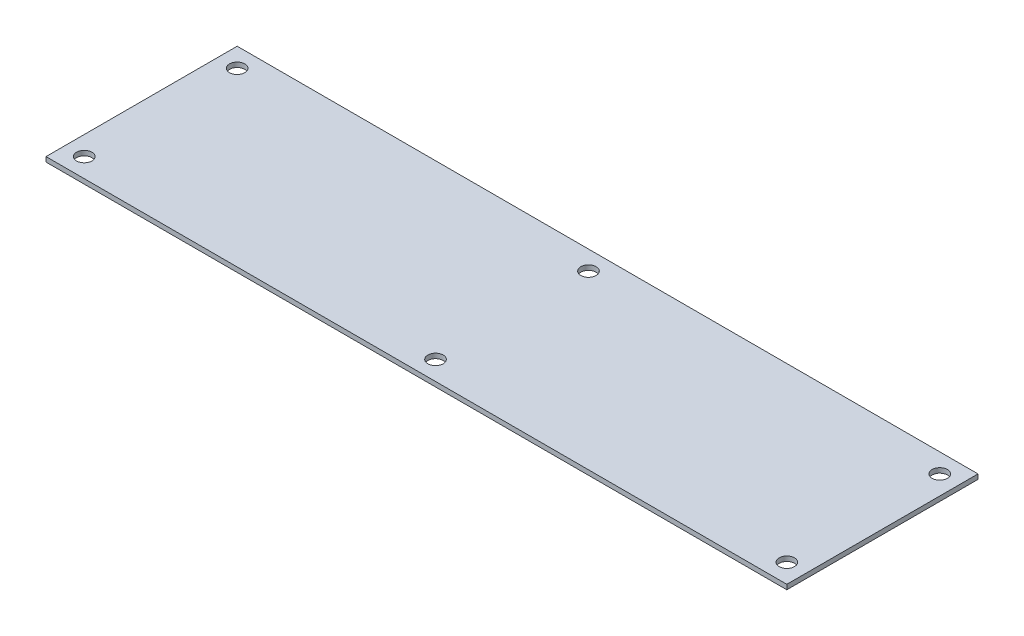
ISO-10303-21;
HEADER;
FILE_DESCRIPTION(('STEP AP214'),'2;1');
FILE_NAME('part.step','',(''),(''),'','','');
FILE_SCHEMA(('AUTOMOTIVE_DESIGN { 1 0 10303 214 1 1 1 1 }'));
ENDSEC;
DATA;
#1=APPLICATION_CONTEXT('core data for automotive mechanical design processes');
#2=APPLICATION_PROTOCOL_DEFINITION('international standard','automotive_design',2000,#1);
#3=PRODUCT_CONTEXT('',#1,'mechanical');
#4=PRODUCT('Part','Part','',(#3));
#5=PRODUCT_RELATED_PRODUCT_CATEGORY('part','',(#4));
#6=PRODUCT_DEFINITION_FORMATION('','',#4);
#7=PRODUCT_DEFINITION_CONTEXT('part definition',#1,'design');
#8=PRODUCT_DEFINITION('design','',#6,#7);
#9=PRODUCT_DEFINITION_SHAPE('','',#8);
#10=(LENGTH_UNIT() NAMED_UNIT(*) SI_UNIT(.MILLI.,.METRE.));
#11=(NAMED_UNIT(*) PLANE_ANGLE_UNIT() SI_UNIT($,.RADIAN.));
#12=(NAMED_UNIT(*) SI_UNIT($,.STERADIAN.) SOLID_ANGLE_UNIT());
#13=UNCERTAINTY_MEASURE_WITH_UNIT(LENGTH_MEASURE(1.E-05),#10,'distance_accuracy_value','');
#14=(GEOMETRIC_REPRESENTATION_CONTEXT(3) GLOBAL_UNCERTAINTY_ASSIGNED_CONTEXT((#13)) GLOBAL_UNIT_ASSIGNED_CONTEXT((#10,
#11,#12)) REPRESENTATION_CONTEXT('',''));
#15=CARTESIAN_POINT('',(0.,0.,0.));
#16=DIRECTION('',(0.,0.,1.));
#17=DIRECTION('',(1.,0.,0.));
#18=AXIS2_PLACEMENT_3D('',#15,#16,#17);
#19=CARTESIAN_POINT('',(-77.5,1.,20.));
#20=DIRECTION('',(1.,0.,0.));
#21=DIRECTION('',(0.,0.,-1.));
#22=AXIS2_PLACEMENT_3D('',#19,#20,#21);
#23=PLANE('',#22);
#24=DIRECTION('',(0.,0.,1.));
#25=VECTOR('',#24,1.);
#26=CARTESIAN_POINT('',(-77.5,0.,20.));
#27=LINE('',#26,#25);
#28=CARTESIAN_POINT('',(-77.5,0.,-20.));
#29=VERTEX_POINT('',#28);
#30=CARTESIAN_POINT('',(-77.5,0.,20.));
#31=VERTEX_POINT('',#30);
#32=EDGE_CURVE('E98',#29,#31,#27,.T.);
#33=ORIENTED_EDGE('',*,*,#32,.T.);
#34=DIRECTION('',(0.,-1.,0.));
#35=VECTOR('',#34,1.);
#36=CARTESIAN_POINT('',(-77.5,1.,20.));
#37=LINE('',#36,#35);
#38=CARTESIAN_POINT('',(-77.5,1.,20.));
#39=VERTEX_POINT('',#38);
#40=EDGE_CURVE('E11',#39,#31,#37,.T.);
#41=ORIENTED_EDGE('',*,*,#40,.F.);
#42=DIRECTION('',(0.,0.,1.));
#43=VECTOR('',#42,1.);
#44=CARTESIAN_POINT('',(-77.5,1.,20.));
#45=LINE('',#44,#43);
#46=CARTESIAN_POINT('',(-77.5,1.,-20.));
#47=VERTEX_POINT('',#46);
#48=EDGE_CURVE('E86',#47,#39,#45,.T.);
#49=ORIENTED_EDGE('',*,*,#48,.F.);
#50=DIRECTION('',(0.,-1.,0.));
#51=VECTOR('',#50,1.);
#52=CARTESIAN_POINT('',(-77.5,1.,-20.));
#53=LINE('',#52,#51);
#54=EDGE_CURVE('E94',#47,#29,#53,.T.);
#55=ORIENTED_EDGE('',*,*,#54,.T.);
#56=EDGE_LOOP('',(#33,#41,#49,#55));
#57=FACE_BOUND('',#56,.T.);
#58=ADVANCED_FACE('F35',(#57),#23,.F.);
#59=CARTESIAN_POINT('',(77.5,1.,20.));
#60=DIRECTION('',(0.,0.,-1.));
#61=DIRECTION('',(-1.,0.,0.));
#62=AXIS2_PLACEMENT_3D('',#59,#60,#61);
#63=PLANE('',#62);
#64=DIRECTION('',(1.,0.,0.));
#65=VECTOR('',#64,1.);
#66=CARTESIAN_POINT('',(77.5,0.,20.));
#67=LINE('',#66,#65);
#68=CARTESIAN_POINT('',(77.5,0.,20.));
#69=VERTEX_POINT('',#68);
#70=EDGE_CURVE('E90',#31,#69,#67,.T.);
#71=ORIENTED_EDGE('',*,*,#70,.T.);
#72=DIRECTION('',(0.,-1.,0.));
#73=VECTOR('',#72,1.);
#74=CARTESIAN_POINT('',(77.5,1.,20.));
#75=LINE('',#74,#73);
#76=CARTESIAN_POINT('',(77.5,1.,20.));
#77=VERTEX_POINT('',#76);
#78=EDGE_CURVE('E43',#77,#69,#75,.T.);
#79=ORIENTED_EDGE('',*,*,#78,.F.);
#80=DIRECTION('',(1.,0.,0.));
#81=VECTOR('',#80,1.);
#82=CARTESIAN_POINT('',(77.5,1.,20.));
#83=LINE('',#82,#81);
#84=EDGE_CURVE('E81',#39,#77,#83,.T.);
#85=ORIENTED_EDGE('',*,*,#84,.F.);
#86=ORIENTED_EDGE('',*,*,#40,.T.);
#87=EDGE_LOOP('',(#71,#79,#85,#86));
#88=FACE_BOUND('',#87,.T.);
#89=ADVANCED_FACE('F89',(#88),#63,.F.);
#90=CARTESIAN_POINT('',(77.5,1.,20.));
#91=DIRECTION('',(-1.,0.,0.));
#92=DIRECTION('',(0.,0.,1.));
#93=AXIS2_PLACEMENT_3D('',#90,#91,#92);
#94=PLANE('',#93);
#95=DIRECTION('',(0.,0.,-1.));
#96=VECTOR('',#95,1.);
#97=CARTESIAN_POINT('',(77.5,0.,20.));
#98=LINE('',#97,#96);
#99=CARTESIAN_POINT('',(77.5,0.,-20.));
#100=VERTEX_POINT('',#99);
#101=EDGE_CURVE('E68',#69,#100,#98,.T.);
#102=ORIENTED_EDGE('',*,*,#101,.T.);
#103=DIRECTION('',(0.,-1.,0.));
#104=VECTOR('',#103,1.);
#105=CARTESIAN_POINT('',(77.5,1.,-20.));
#106=LINE('',#105,#104);
#107=CARTESIAN_POINT('',(77.5,1.,-20.));
#108=VERTEX_POINT('',#107);
#109=EDGE_CURVE('E91',#108,#100,#106,.T.);
#110=ORIENTED_EDGE('',*,*,#109,.F.);
#111=DIRECTION('',(0.,0.,-1.));
#112=VECTOR('',#111,1.);
#113=CARTESIAN_POINT('',(77.5,1.,20.));
#114=LINE('',#113,#112);
#115=EDGE_CURVE('E84',#77,#108,#114,.T.);
#116=ORIENTED_EDGE('',*,*,#115,.F.);
#117=ORIENTED_EDGE('',*,*,#78,.T.);
#118=EDGE_LOOP('',(#102,#110,#116,#117));
#119=FACE_BOUND('',#118,.T.);
#120=ADVANCED_FACE('F92',(#119),#94,.F.);
#121=CARTESIAN_POINT('',(77.5,1.,-20.));
#122=DIRECTION('',(0.,0.,1.));
#123=DIRECTION('',(1.,0.,0.));
#124=AXIS2_PLACEMENT_3D('',#121,#122,#123);
#125=PLANE('',#124);
#126=DIRECTION('',(-1.,0.,0.));
#127=VECTOR('',#126,1.);
#128=CARTESIAN_POINT('',(77.5,0.,-20.));
#129=LINE('',#128,#127);
#130=EDGE_CURVE('E74',#100,#29,#129,.T.);
#131=ORIENTED_EDGE('',*,*,#130,.T.);
#132=ORIENTED_EDGE('',*,*,#54,.F.);
#133=DIRECTION('',(-1.,0.,0.));
#134=VECTOR('',#133,1.);
#135=CARTESIAN_POINT('',(77.5,1.,-20.));
#136=LINE('',#135,#134);
#137=EDGE_CURVE('E51',#108,#47,#136,.T.);
#138=ORIENTED_EDGE('',*,*,#137,.F.);
#139=ORIENTED_EDGE('',*,*,#109,.T.);
#140=EDGE_LOOP('',(#131,#132,#138,#139));
#141=FACE_BOUND('',#140,.T.);
#142=ADVANCED_FACE('F106',(#141),#125,.F.);
#143=CARTESIAN_POINT('',(0.,1.,0.));
#144=DIRECTION('',(0.,1.,0.));
#145=DIRECTION('',(0.,0.,1.));
#146=AXIS2_PLACEMENT_3D('',#143,#144,#145);
#147=PLANE('',#146);
#148=CARTESIAN_POINT('',(0.,1.,16.));
#149=DIRECTION('',(0.,1.,0.));
#150=DIRECTION('',(0.,0.,1.));
#151=AXIS2_PLACEMENT_3D('',#148,#149,#150);
#152=CIRCLE('',#151,1.6);
#153=CARTESIAN_POINT('',(0.,1.,17.6));
#154=VERTEX_POINT('',#153);
#155=EDGE_CURVE('E142',#154,#154,#152,.T.);
#156=ORIENTED_EDGE('',*,*,#155,.F.);
#157=EDGE_LOOP('',(#156));
#158=FACE_BOUND('',#157,.T.);
#159=CARTESIAN_POINT('',(0.,1.,-16.));
#160=DIRECTION('',(0.,1.,0.));
#161=DIRECTION('',(0.,0.,1.));
#162=AXIS2_PLACEMENT_3D('',#159,#160,#161);
#163=CIRCLE('',#162,1.6);
#164=CARTESIAN_POINT('',(0.,1.,-14.4));
#165=VERTEX_POINT('',#164);
#166=EDGE_CURVE('E136',#165,#165,#163,.T.);
#167=ORIENTED_EDGE('',*,*,#166,.F.);
#168=EDGE_LOOP('',(#167));
#169=FACE_BOUND('',#168,.T.);
#170=CARTESIAN_POINT('',(73.5,1.,16.));
#171=DIRECTION('',(0.,1.,0.));
#172=DIRECTION('',(0.,0.,1.));
#173=AXIS2_PLACEMENT_3D('',#170,#171,#172);
#174=CIRCLE('',#173,1.6);
#175=CARTESIAN_POINT('',(73.5,1.,17.6));
#176=VERTEX_POINT('',#175);
#177=EDGE_CURVE('E130',#176,#176,#174,.T.);
#178=ORIENTED_EDGE('',*,*,#177,.F.);
#179=EDGE_LOOP('',(#178));
#180=FACE_BOUND('',#179,.T.);
#181=CARTESIAN_POINT('',(73.5,1.,-16.));
#182=DIRECTION('',(0.,1.,0.));
#183=DIRECTION('',(0.,0.,1.));
#184=AXIS2_PLACEMENT_3D('',#181,#182,#183);
#185=CIRCLE('',#184,1.6);
#186=CARTESIAN_POINT('',(73.5,1.,-14.4));
#187=VERTEX_POINT('',#186);
#188=EDGE_CURVE('E124',#187,#187,#185,.T.);
#189=ORIENTED_EDGE('',*,*,#188,.F.);
#190=EDGE_LOOP('',(#189));
#191=FACE_BOUND('',#190,.T.);
#192=CARTESIAN_POINT('',(-73.5,1.,16.));
#193=DIRECTION('',(0.,1.,0.));
#194=DIRECTION('',(0.,0.,1.));
#195=AXIS2_PLACEMENT_3D('',#192,#193,#194);
#196=CIRCLE('',#195,1.6);
#197=CARTESIAN_POINT('',(-73.5,1.,17.6));
#198=VERTEX_POINT('',#197);
#199=EDGE_CURVE('E118',#198,#198,#196,.T.);
#200=ORIENTED_EDGE('',*,*,#199,.F.);
#201=EDGE_LOOP('',(#200));
#202=FACE_BOUND('',#201,.T.);
#203=CARTESIAN_POINT('',(-73.5,1.,-16.));
#204=DIRECTION('',(0.,1.,0.));
#205=DIRECTION('',(0.,0.,1.));
#206=AXIS2_PLACEMENT_3D('',#203,#204,#205);
#207=CIRCLE('',#206,1.6);
#208=CARTESIAN_POINT('',(-73.5,1.,-14.4));
#209=VERTEX_POINT('',#208);
#210=EDGE_CURVE('E112',#209,#209,#207,.T.);
#211=ORIENTED_EDGE('',*,*,#210,.F.);
#212=EDGE_LOOP('',(#211));
#213=FACE_BOUND('',#212,.T.);
#214=ORIENTED_EDGE('',*,*,#48,.T.);
#215=ORIENTED_EDGE('',*,*,#84,.T.);
#216=ORIENTED_EDGE('',*,*,#115,.T.);
#217=ORIENTED_EDGE('',*,*,#137,.T.);
#218=EDGE_LOOP('',(#214,#215,#216,#217));
#219=FACE_BOUND('',#218,.T.);
#220=ADVANCED_FACE('F82',(#158,#169,#180,#191,#202,#213,#219),#147,.T.);
#221=CARTESIAN_POINT('',(0.,0.,0.));
#222=DIRECTION('',(0.,1.,0.));
#223=DIRECTION('',(0.,0.,1.));
#224=AXIS2_PLACEMENT_3D('',#221,#222,#223);
#225=PLANE('',#224);
#226=CARTESIAN_POINT('',(0.,0.,16.));
#227=DIRECTION('',(0.,1.,0.));
#228=DIRECTION('',(0.,0.,1.));
#229=AXIS2_PLACEMENT_3D('',#226,#227,#228);
#230=CIRCLE('',#229,1.6);
#231=CARTESIAN_POINT('',(0.,0.,17.6));
#232=VERTEX_POINT('',#231);
#233=EDGE_CURVE('E139',#232,#232,#230,.T.);
#234=ORIENTED_EDGE('',*,*,#233,.T.);
#235=EDGE_LOOP('',(#234));
#236=FACE_BOUND('',#235,.T.);
#237=CARTESIAN_POINT('',(0.,0.,-16.));
#238=DIRECTION('',(0.,1.,0.));
#239=DIRECTION('',(0.,0.,1.));
#240=AXIS2_PLACEMENT_3D('',#237,#238,#239);
#241=CIRCLE('',#240,1.6);
#242=CARTESIAN_POINT('',(0.,0.,-14.4));
#243=VERTEX_POINT('',#242);
#244=EDGE_CURVE('E133',#243,#243,#241,.T.);
#245=ORIENTED_EDGE('',*,*,#244,.T.);
#246=EDGE_LOOP('',(#245));
#247=FACE_BOUND('',#246,.T.);
#248=CARTESIAN_POINT('',(73.5,0.,16.));
#249=DIRECTION('',(0.,1.,0.));
#250=DIRECTION('',(0.,0.,1.));
#251=AXIS2_PLACEMENT_3D('',#248,#249,#250);
#252=CIRCLE('',#251,1.6);
#253=CARTESIAN_POINT('',(73.5,0.,17.6));
#254=VERTEX_POINT('',#253);
#255=EDGE_CURVE('E127',#254,#254,#252,.T.);
#256=ORIENTED_EDGE('',*,*,#255,.T.);
#257=EDGE_LOOP('',(#256));
#258=FACE_BOUND('',#257,.T.);
#259=CARTESIAN_POINT('',(73.5,0.,-16.));
#260=DIRECTION('',(0.,1.,0.));
#261=DIRECTION('',(0.,0.,1.));
#262=AXIS2_PLACEMENT_3D('',#259,#260,#261);
#263=CIRCLE('',#262,1.6);
#264=CARTESIAN_POINT('',(73.5,0.,-14.4));
#265=VERTEX_POINT('',#264);
#266=EDGE_CURVE('E121',#265,#265,#263,.T.);
#267=ORIENTED_EDGE('',*,*,#266,.T.);
#268=EDGE_LOOP('',(#267));
#269=FACE_BOUND('',#268,.T.);
#270=CARTESIAN_POINT('',(-73.5,0.,16.));
#271=DIRECTION('',(0.,1.,0.));
#272=DIRECTION('',(0.,0.,1.));
#273=AXIS2_PLACEMENT_3D('',#270,#271,#272);
#274=CIRCLE('',#273,1.6);
#275=CARTESIAN_POINT('',(-73.5,0.,17.6));
#276=VERTEX_POINT('',#275);
#277=EDGE_CURVE('E115',#276,#276,#274,.T.);
#278=ORIENTED_EDGE('',*,*,#277,.T.);
#279=EDGE_LOOP('',(#278));
#280=FACE_BOUND('',#279,.T.);
#281=CARTESIAN_POINT('',(-73.5,0.,-16.));
#282=DIRECTION('',(0.,1.,0.));
#283=DIRECTION('',(0.,0.,1.));
#284=AXIS2_PLACEMENT_3D('',#281,#282,#283);
#285=CIRCLE('',#284,1.6);
#286=CARTESIAN_POINT('',(-73.5,0.,-14.4));
#287=VERTEX_POINT('',#286);
#288=EDGE_CURVE('E101',#287,#287,#285,.T.);
#289=ORIENTED_EDGE('',*,*,#288,.T.);
#290=EDGE_LOOP('',(#289));
#291=FACE_BOUND('',#290,.T.);
#292=ORIENTED_EDGE('',*,*,#32,.F.);
#293=ORIENTED_EDGE('',*,*,#130,.F.);
#294=ORIENTED_EDGE('',*,*,#101,.F.);
#295=ORIENTED_EDGE('',*,*,#70,.F.);
#296=EDGE_LOOP('',(#292,#293,#294,#295));
#297=FACE_BOUND('',#296,.T.);
#298=ADVANCED_FACE('F109',(#236,#247,#258,#269,#280,#291,#297),#225,.F.);
#299=CARTESIAN_POINT('',(-73.5,0.,-16.));
#300=DIRECTION('',(0.,1.,0.));
#301=DIRECTION('',(0.,0.,1.));
#302=AXIS2_PLACEMENT_3D('',#299,#300,#301);
#303=CYLINDRICAL_SURFACE('',#302,1.6);
#304=ORIENTED_EDGE('',*,*,#288,.F.);
#305=EDGE_LOOP('',(#304));
#306=FACE_BOUND('',#305,.T.);
#307=ORIENTED_EDGE('',*,*,#210,.T.);
#308=EDGE_LOOP('',(#307));
#309=FACE_BOUND('',#308,.T.);
#310=ADVANCED_FACE('F170',(#306,#309),#303,.F.);
#311=CARTESIAN_POINT('',(-73.5,0.,16.));
#312=DIRECTION('',(0.,1.,0.));
#313=DIRECTION('',(0.,0.,1.));
#314=AXIS2_PLACEMENT_3D('',#311,#312,#313);
#315=CYLINDRICAL_SURFACE('',#314,1.6);
#316=ORIENTED_EDGE('',*,*,#277,.F.);
#317=EDGE_LOOP('',(#316));
#318=FACE_BOUND('',#317,.T.);
#319=ORIENTED_EDGE('',*,*,#199,.T.);
#320=EDGE_LOOP('',(#319));
#321=FACE_BOUND('',#320,.T.);
#322=ADVANCED_FACE('F172',(#318,#321),#315,.F.);
#323=CARTESIAN_POINT('',(73.5,0.,-16.));
#324=DIRECTION('',(0.,1.,0.));
#325=DIRECTION('',(0.,0.,1.));
#326=AXIS2_PLACEMENT_3D('',#323,#324,#325);
#327=CYLINDRICAL_SURFACE('',#326,1.6);
#328=ORIENTED_EDGE('',*,*,#266,.F.);
#329=EDGE_LOOP('',(#328));
#330=FACE_BOUND('',#329,.T.);
#331=ORIENTED_EDGE('',*,*,#188,.T.);
#332=EDGE_LOOP('',(#331));
#333=FACE_BOUND('',#332,.T.);
#334=ADVANCED_FACE('F179',(#330,#333),#327,.F.);
#335=CARTESIAN_POINT('',(73.5,0.,16.));
#336=DIRECTION('',(0.,1.,0.));
#337=DIRECTION('',(0.,0.,1.));
#338=AXIS2_PLACEMENT_3D('',#335,#336,#337);
#339=CYLINDRICAL_SURFACE('',#338,1.6);
#340=ORIENTED_EDGE('',*,*,#255,.F.);
#341=EDGE_LOOP('',(#340));
#342=FACE_BOUND('',#341,.T.);
#343=ORIENTED_EDGE('',*,*,#177,.T.);
#344=EDGE_LOOP('',(#343));
#345=FACE_BOUND('',#344,.T.);
#346=ADVANCED_FACE('F225',(#342,#345),#339,.F.);
#347=CARTESIAN_POINT('',(0.,0.,-16.));
#348=DIRECTION('',(0.,1.,0.));
#349=DIRECTION('',(0.,0.,1.));
#350=AXIS2_PLACEMENT_3D('',#347,#348,#349);
#351=CYLINDRICAL_SURFACE('',#350,1.6);
#352=ORIENTED_EDGE('',*,*,#244,.F.);
#353=EDGE_LOOP('',(#352));
#354=FACE_BOUND('',#353,.T.);
#355=ORIENTED_EDGE('',*,*,#166,.T.);
#356=EDGE_LOOP('',(#355));
#357=FACE_BOUND('',#356,.T.);
#358=ADVANCED_FACE('F153',(#354,#357),#351,.F.);
#359=CARTESIAN_POINT('',(0.,0.,16.));
#360=DIRECTION('',(0.,1.,0.));
#361=DIRECTION('',(0.,0.,1.));
#362=AXIS2_PLACEMENT_3D('',#359,#360,#361);
#363=CYLINDRICAL_SURFACE('',#362,1.6);
#364=ORIENTED_EDGE('',*,*,#233,.F.);
#365=EDGE_LOOP('',(#364));
#366=FACE_BOUND('',#365,.T.);
#367=ORIENTED_EDGE('',*,*,#155,.T.);
#368=EDGE_LOOP('',(#367));
#369=FACE_BOUND('',#368,.T.);
#370=ADVANCED_FACE('F150',(#366,#369),#363,.F.);
#371=CLOSED_SHELL('',(#58,#89,#120,#142,#220,#298,#310,#322,#334,#346,#358,#370));
#372=MANIFOLD_SOLID_BREP('B2',#371);
#373=ADVANCED_BREP_SHAPE_REPRESENTATION('',(#18,#372),#14);
#374=SHAPE_DEFINITION_REPRESENTATION(#9,#373);
ENDSEC;
END-ISO-10303-21;
